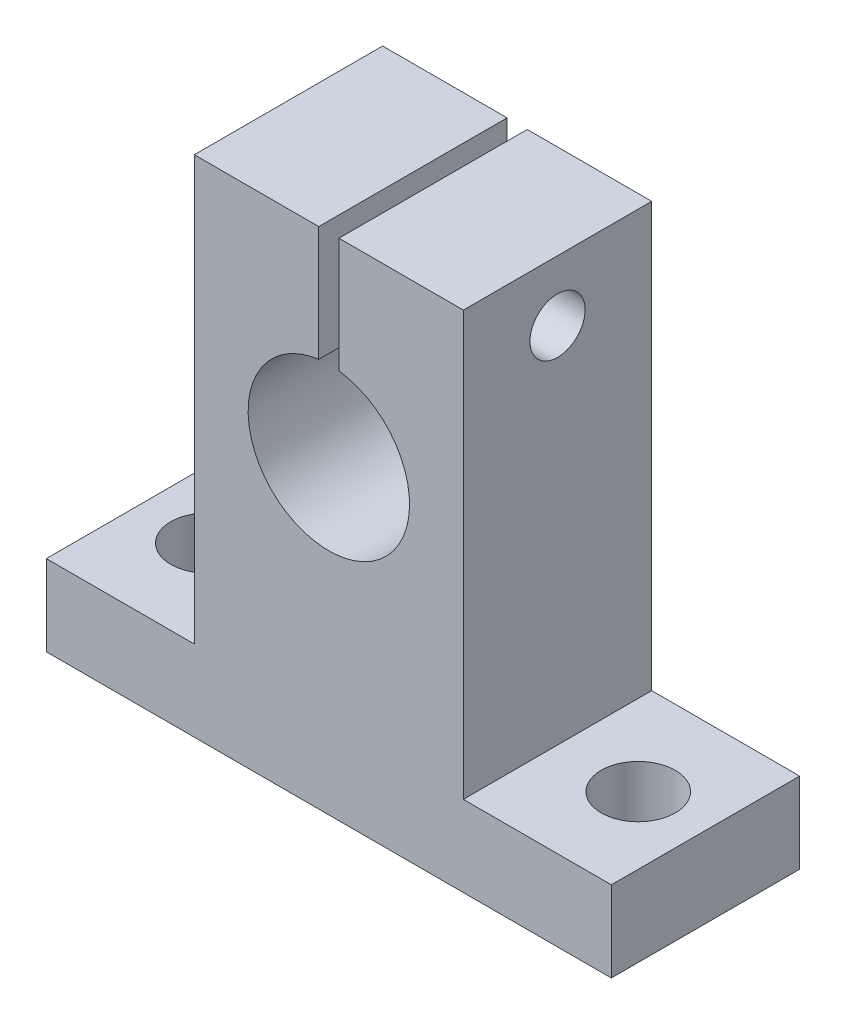
ISO-10303-21;
HEADER;
FILE_DESCRIPTION(('STEP AP214'),'2;1');
FILE_NAME('part.step','',(''),(''),'','','');
FILE_SCHEMA(('AUTOMOTIVE_DESIGN { 1 0 10303 214 1 1 1 1 }'));
ENDSEC;
DATA;
#1=APPLICATION_CONTEXT('core data for automotive mechanical design processes');
#2=APPLICATION_PROTOCOL_DEFINITION('international standard','automotive_design',2000,#1);
#3=PRODUCT_CONTEXT('',#1,'mechanical');
#4=PRODUCT('Part','Part','',(#3));
#5=PRODUCT_RELATED_PRODUCT_CATEGORY('part','',(#4));
#6=PRODUCT_DEFINITION_FORMATION('','',#4);
#7=PRODUCT_DEFINITION_CONTEXT('part definition',#1,'design');
#8=PRODUCT_DEFINITION('design','',#6,#7);
#9=PRODUCT_DEFINITION_SHAPE('','',#8);
#10=(LENGTH_UNIT() NAMED_UNIT(*) SI_UNIT(.MILLI.,.METRE.));
#11=(NAMED_UNIT(*) PLANE_ANGLE_UNIT() SI_UNIT($,.RADIAN.));
#12=(NAMED_UNIT(*) SI_UNIT($,.STERADIAN.) SOLID_ANGLE_UNIT());
#13=UNCERTAINTY_MEASURE_WITH_UNIT(LENGTH_MEASURE(1.E-05),#10,'distance_accuracy_value','');
#14=(GEOMETRIC_REPRESENTATION_CONTEXT(3) GLOBAL_UNCERTAINTY_ASSIGNED_CONTEXT((#13)) GLOBAL_UNIT_ASSIGNED_CONTEXT((#10,
#11,#12)) REPRESENTATION_CONTEXT('',''));
#15=CARTESIAN_POINT('',(0.,0.,0.));
#16=DIRECTION('',(0.,0.,1.));
#17=DIRECTION('',(1.,0.,0.));
#18=AXIS2_PLACEMENT_3D('',#15,#16,#17);
#19=CARTESIAN_POINT('',(10.,37.5,7.));
#20=DIRECTION('',(0.,-1.,0.));
#21=DIRECTION('',(0.,0.,-1.));
#22=AXIS2_PLACEMENT_3D('',#19,#20,#21);
#23=PLANE('',#22);
#24=DIRECTION('',(-1.,0.,0.));
#25=VECTOR('',#24,1.);
#26=CARTESIAN_POINT('',(10.,37.5,-7.));
#27=LINE('',#26,#25);
#28=CARTESIAN_POINT('',(10.,37.5,-7.));
#29=VERTEX_POINT('',#28);
#30=CARTESIAN_POINT('',(0.74999999999995,37.5,-7.));
#31=VERTEX_POINT('',#30);
#32=EDGE_CURVE('E163',#29,#31,#27,.T.);
#33=ORIENTED_EDGE('',*,*,#32,.T.);
#34=DIRECTION('',(0.,0.,1.));
#35=VECTOR('',#34,1.);
#36=CARTESIAN_POINT('',(0.74999999999995,37.5,7.));
#37=LINE('',#36,#35);
#38=CARTESIAN_POINT('',(0.74999999999995,37.5,7.));
#39=VERTEX_POINT('',#38);
#40=EDGE_CURVE('E191',#31,#39,#37,.T.);
#41=ORIENTED_EDGE('',*,*,#40,.T.);
#42=DIRECTION('',(-1.,0.,0.));
#43=VECTOR('',#42,1.);
#44=CARTESIAN_POINT('',(10.,37.5,7.));
#45=LINE('',#44,#43);
#46=CARTESIAN_POINT('',(10.,37.5,7.));
#47=VERTEX_POINT('',#46);
#48=EDGE_CURVE('E145',#47,#39,#45,.T.);
#49=ORIENTED_EDGE('',*,*,#48,.F.);
#50=DIRECTION('',(0.,0.,-1.));
#51=VECTOR('',#50,1.);
#52=CARTESIAN_POINT('',(10.,37.5,7.));
#53=LINE('',#52,#51);
#54=EDGE_CURVE('E149',#47,#29,#53,.T.);
#55=ORIENTED_EDGE('',*,*,#54,.T.);
#56=EDGE_LOOP('',(#33,#41,#49,#55));
#57=FACE_BOUND('',#56,.T.);
#58=ADVANCED_FACE('F32',(#57),#23,.F.);
#59=CARTESIAN_POINT('',(-21.,33.,0.));
#60=DIRECTION('',(1.,0.,0.));
#61=DIRECTION('',(0.,0.,-1.));
#62=AXIS2_PLACEMENT_3D('',#59,#60,#61);
#63=CYLINDRICAL_SURFACE('',#62,2.05);
#64=CARTESIAN_POINT('',(0.749999999999966,33.,0.));
#65=DIRECTION('',(1.,0.,0.));
#66=DIRECTION('',(0.,1.,0.));
#67=AXIS2_PLACEMENT_3D('',#64,#65,#66);
#68=CIRCLE('',#67,2.05);
#69=CARTESIAN_POINT('',(0.749999999999958,35.05,0.));
#70=VERTEX_POINT('',#69);
#71=EDGE_CURVE('E36',#70,#70,#68,.F.);
#72=ORIENTED_EDGE('',*,*,#71,.T.);
#73=EDGE_LOOP('',(#72));
#74=FACE_BOUND('',#73,.T.);
#75=CARTESIAN_POINT('',(10.,33.,0.));
#76=DIRECTION('',(1.,0.,0.));
#77=DIRECTION('',(0.,0.,-1.));
#78=AXIS2_PLACEMENT_3D('',#75,#76,#77);
#79=CIRCLE('',#78,2.05);
#80=CARTESIAN_POINT('',(10.,33.,-2.05));
#81=VERTEX_POINT('',#80);
#82=EDGE_CURVE('E176',#81,#81,#79,.T.);
#83=ORIENTED_EDGE('',*,*,#82,.T.);
#84=EDGE_LOOP('',(#83));
#85=FACE_BOUND('',#84,.T.);
#86=ADVANCED_FACE('F280',(#74,#85),#63,.F.);
#87=CARTESIAN_POINT('',(0.,0.,7.));
#88=DIRECTION('',(0.,1.,0.));
#89=DIRECTION('',(0.,0.,1.));
#90=AXIS2_PLACEMENT_3D('',#87,#88,#89);
#91=PLANE('',#90);
#92=CARTESIAN_POINT('',(16.,0.,0.));
#93=DIRECTION('',(0.,1.,0.));
#94=DIRECTION('',(0.,0.,1.));
#95=AXIS2_PLACEMENT_3D('',#92,#93,#94);
#96=CIRCLE('',#95,2.75);
#97=CARTESIAN_POINT('',(16.,0.,2.75));
#98=VERTEX_POINT('',#97);
#99=EDGE_CURVE('E197',#98,#98,#96,.T.);
#100=ORIENTED_EDGE('',*,*,#99,.T.);
#101=EDGE_LOOP('',(#100));
#102=FACE_BOUND('',#101,.T.);
#103=CARTESIAN_POINT('',(-16.,0.,0.));
#104=DIRECTION('',(0.,1.,0.));
#105=DIRECTION('',(0.,0.,1.));
#106=AXIS2_PLACEMENT_3D('',#103,#104,#105);
#107=CIRCLE('',#106,2.75);
#108=CARTESIAN_POINT('',(-16.,0.,2.75));
#109=VERTEX_POINT('',#108);
#110=EDGE_CURVE('E203',#109,#109,#107,.T.);
#111=ORIENTED_EDGE('',*,*,#110,.T.);
#112=EDGE_LOOP('',(#111));
#113=FACE_BOUND('',#112,.T.);
#114=DIRECTION('',(1.,0.,0.));
#115=VECTOR('',#114,1.);
#116=CARTESIAN_POINT('',(0.,0.,-7.));
#117=LINE('',#116,#115);
#118=CARTESIAN_POINT('',(-21.,0.,-7.));
#119=VERTEX_POINT('',#118);
#120=CARTESIAN_POINT('',(21.,0.,-7.));
#121=VERTEX_POINT('',#120);
#122=EDGE_CURVE('E154',#119,#121,#117,.T.);
#123=ORIENTED_EDGE('',*,*,#122,.T.);
#124=DIRECTION('',(0.,0.,-1.));
#125=VECTOR('',#124,1.);
#126=CARTESIAN_POINT('',(21.,0.,7.));
#127=LINE('',#126,#125);
#128=CARTESIAN_POINT('',(21.,0.,7.));
#129=VERTEX_POINT('',#128);
#130=EDGE_CURVE('E11',#129,#121,#127,.T.);
#131=ORIENTED_EDGE('',*,*,#130,.F.);
#132=DIRECTION('',(1.,0.,0.));
#133=VECTOR('',#132,1.);
#134=CARTESIAN_POINT('',(0.,0.,7.));
#135=LINE('',#134,#133);
#136=CARTESIAN_POINT('',(-21.,0.,7.));
#137=VERTEX_POINT('',#136);
#138=EDGE_CURVE('E166',#137,#129,#135,.T.);
#139=ORIENTED_EDGE('',*,*,#138,.F.);
#140=DIRECTION('',(0.,0.,-1.));
#141=VECTOR('',#140,1.);
#142=CARTESIAN_POINT('',(-21.,0.,7.));
#143=LINE('',#142,#141);
#144=EDGE_CURVE('E221',#137,#119,#143,.T.);
#145=ORIENTED_EDGE('',*,*,#144,.T.);
#146=EDGE_LOOP('',(#123,#131,#139,#145));
#147=FACE_BOUND('',#146,.T.);
#148=ADVANCED_FACE('F34',(#102,#113,#147),#91,.F.);
#149=CARTESIAN_POINT('',(21.,0.,7.));
#150=DIRECTION('',(-1.,0.,0.));
#151=DIRECTION('',(0.,0.,1.));
#152=AXIS2_PLACEMENT_3D('',#149,#150,#151);
#153=PLANE('',#152);
#154=DIRECTION('',(0.,1.,0.));
#155=VECTOR('',#154,1.);
#156=CARTESIAN_POINT('',(21.,0.,-7.));
#157=LINE('',#156,#155);
#158=CARTESIAN_POINT('',(21.,6.,-7.));
#159=VERTEX_POINT('',#158);
#160=EDGE_CURVE('E156',#121,#159,#157,.T.);
#161=ORIENTED_EDGE('',*,*,#160,.T.);
#162=DIRECTION('',(0.,0.,-1.));
#163=VECTOR('',#162,1.);
#164=CARTESIAN_POINT('',(21.,6.,7.));
#165=LINE('',#164,#163);
#166=CARTESIAN_POINT('',(21.,6.,7.));
#167=VERTEX_POINT('',#166);
#168=EDGE_CURVE('E41',#167,#159,#165,.T.);
#169=ORIENTED_EDGE('',*,*,#168,.F.);
#170=DIRECTION('',(0.,1.,0.));
#171=VECTOR('',#170,1.);
#172=CARTESIAN_POINT('',(21.,0.,7.));
#173=LINE('',#172,#171);
#174=EDGE_CURVE('E237',#129,#167,#173,.T.);
#175=ORIENTED_EDGE('',*,*,#174,.F.);
#176=ORIENTED_EDGE('',*,*,#130,.T.);
#177=EDGE_LOOP('',(#161,#169,#175,#176));
#178=FACE_BOUND('',#177,.T.);
#179=ADVANCED_FACE('F272',(#178),#153,.F.);
#180=CARTESIAN_POINT('',(21.,6.,7.));
#181=DIRECTION('',(0.,-1.,0.));
#182=DIRECTION('',(1.,0.,0.));
#183=AXIS2_PLACEMENT_3D('',#180,#181,#182);
#184=PLANE('',#183);
#185=CARTESIAN_POINT('',(16.,6.,0.));
#186=DIRECTION('',(0.,1.,0.));
#187=DIRECTION('',(-1.,0.,0.));
#188=AXIS2_PLACEMENT_3D('',#185,#186,#187);
#189=CIRCLE('',#188,2.75);
#190=CARTESIAN_POINT('',(13.25,6.,0.));
#191=VERTEX_POINT('',#190);
#192=EDGE_CURVE('E194',#191,#191,#189,.T.);
#193=ORIENTED_EDGE('',*,*,#192,.F.);
#194=EDGE_LOOP('',(#193));
#195=FACE_BOUND('',#194,.T.);
#196=DIRECTION('',(-1.,0.,0.));
#197=VECTOR('',#196,1.);
#198=CARTESIAN_POINT('',(21.,6.,-7.));
#199=LINE('',#198,#197);
#200=CARTESIAN_POINT('',(10.,6.,-7.));
#201=VERTEX_POINT('',#200);
#202=EDGE_CURVE('E158',#159,#201,#199,.T.);
#203=ORIENTED_EDGE('',*,*,#202,.T.);
#204=DIRECTION('',(0.,0.,-1.));
#205=VECTOR('',#204,1.);
#206=CARTESIAN_POINT('',(10.,6.,7.));
#207=LINE('',#206,#205);
#208=CARTESIAN_POINT('',(10.,6.,7.));
#209=VERTEX_POINT('',#208);
#210=EDGE_CURVE('E169',#209,#201,#207,.T.);
#211=ORIENTED_EDGE('',*,*,#210,.F.);
#212=DIRECTION('',(-1.,0.,0.));
#213=VECTOR('',#212,1.);
#214=CARTESIAN_POINT('',(21.,6.,7.));
#215=LINE('',#214,#213);
#216=EDGE_CURVE('E150',#167,#209,#215,.T.);
#217=ORIENTED_EDGE('',*,*,#216,.F.);
#218=ORIENTED_EDGE('',*,*,#168,.T.);
#219=EDGE_LOOP('',(#203,#211,#217,#218));
#220=FACE_BOUND('',#219,.T.);
#221=ADVANCED_FACE('F245',(#195,#220),#184,.F.);
#222=CARTESIAN_POINT('',(10.,6.,7.));
#223=DIRECTION('',(-1.,0.,0.));
#224=DIRECTION('',(0.,0.,1.));
#225=AXIS2_PLACEMENT_3D('',#222,#223,#224);
#226=PLANE('',#225);
#227=ORIENTED_EDGE('',*,*,#82,.F.);
#228=EDGE_LOOP('',(#227));
#229=FACE_BOUND('',#228,.T.);
#230=DIRECTION('',(0.,1.,0.));
#231=VECTOR('',#230,1.);
#232=CARTESIAN_POINT('',(10.,6.,-7.));
#233=LINE('',#232,#231);
#234=EDGE_CURVE('E160',#201,#29,#233,.T.);
#235=ORIENTED_EDGE('',*,*,#234,.T.);
#236=ORIENTED_EDGE('',*,*,#54,.F.);
#237=DIRECTION('',(0.,1.,0.));
#238=VECTOR('',#237,1.);
#239=CARTESIAN_POINT('',(10.,6.,7.));
#240=LINE('',#239,#238);
#241=EDGE_CURVE('E146',#209,#47,#240,.T.);
#242=ORIENTED_EDGE('',*,*,#241,.F.);
#243=ORIENTED_EDGE('',*,*,#210,.T.);
#244=EDGE_LOOP('',(#235,#236,#242,#243));
#245=FACE_BOUND('',#244,.T.);
#246=ADVANCED_FACE('F249',(#229,#245),#226,.F.);
#247=CARTESIAN_POINT('',(-0.75000000000005,37.5,7.));
#248=VERTEX_POINT('',#247);
#249=CARTESIAN_POINT('',(-10.,37.5,7.));
#250=VERTEX_POINT('',#249);
#251=EDGE_CURVE('E135',#248,#250,#45,.T.);
#252=ORIENTED_EDGE('',*,*,#251,.F.);
#253=DIRECTION('',(0.,0.,-1.));
#254=VECTOR('',#253,1.);
#255=CARTESIAN_POINT('',(-0.750000000000048,37.5,7.));
#256=LINE('',#255,#254);
#257=CARTESIAN_POINT('',(-0.75000000000005,37.5,-7.));
#258=VERTEX_POINT('',#257);
#259=EDGE_CURVE('E121',#248,#258,#256,.T.);
#260=ORIENTED_EDGE('',*,*,#259,.T.);
#261=CARTESIAN_POINT('',(-10.,37.5,-7.));
#262=VERTEX_POINT('',#261);
#263=EDGE_CURVE('E162',#258,#262,#27,.T.);
#264=ORIENTED_EDGE('',*,*,#263,.T.);
#265=DIRECTION('',(0.,0.,-1.));
#266=VECTOR('',#265,1.);
#267=CARTESIAN_POINT('',(-10.,37.5,7.));
#268=LINE('',#267,#266);
#269=EDGE_CURVE('E143',#250,#262,#268,.T.);
#270=ORIENTED_EDGE('',*,*,#269,.F.);
#271=EDGE_LOOP('',(#252,#260,#264,#270));
#272=FACE_BOUND('',#271,.T.);
#273=ADVANCED_FACE('F141',(#272),#23,.F.);
#274=CARTESIAN_POINT('',(0.,0.,7.));
#275=DIRECTION('',(0.,0.,1.));
#276=DIRECTION('',(1.,0.,0.));
#277=AXIS2_PLACEMENT_3D('',#274,#275,#276);
#278=PLANE('',#277);
#279=DIRECTION('',(0.,1.,0.));
#280=VECTOR('',#279,1.);
#281=CARTESIAN_POINT('',(0.749999999999897,52.,7.));
#282=LINE('',#281,#280);
#283=CARTESIAN_POINT('',(0.749999999999981,28.9529404498953,7.));
#284=VERTEX_POINT('',#283);
#285=EDGE_CURVE('E139',#284,#39,#282,.T.);
#286=ORIENTED_EDGE('',*,*,#285,.F.);
#287=CARTESIAN_POINT('',(0.,23.,7.));
#288=DIRECTION('',(0.,0.,1.));
#289=DIRECTION('',(1.,0.,0.));
#290=AXIS2_PLACEMENT_3D('',#287,#288,#289);
#291=CIRCLE('',#290,6.);
#292=CARTESIAN_POINT('',(-0.750000000000019,28.9529404498953,7.));
#293=VERTEX_POINT('',#292);
#294=EDGE_CURVE('E138',#293,#284,#291,.T.);
#295=ORIENTED_EDGE('',*,*,#294,.F.);
#296=DIRECTION('',(0.,-1.,0.));
#297=VECTOR('',#296,1.);
#298=CARTESIAN_POINT('',(-0.750000000000103,52.,7.));
#299=LINE('',#298,#297);
#300=EDGE_CURVE('E49',#248,#293,#299,.T.);
#301=ORIENTED_EDGE('',*,*,#300,.F.);
#302=ORIENTED_EDGE('',*,*,#251,.T.);
#303=DIRECTION('',(0.,1.,0.));
#304=VECTOR('',#303,1.);
#305=CARTESIAN_POINT('',(-10.,6.,7.));
#306=LINE('',#305,#304);
#307=CARTESIAN_POINT('',(-10.,6.,7.));
#308=VERTEX_POINT('',#307);
#309=EDGE_CURVE('E212',#308,#250,#306,.T.);
#310=ORIENTED_EDGE('',*,*,#309,.F.);
#311=DIRECTION('',(1.,0.,0.));
#312=VECTOR('',#311,1.);
#313=CARTESIAN_POINT('',(-21.,6.,7.));
#314=LINE('',#313,#312);
#315=CARTESIAN_POINT('',(-21.,6.,7.));
#316=VERTEX_POINT('',#315);
#317=EDGE_CURVE('E214',#316,#308,#314,.T.);
#318=ORIENTED_EDGE('',*,*,#317,.F.);
#319=DIRECTION('',(0.,1.,0.));
#320=VECTOR('',#319,1.);
#321=CARTESIAN_POINT('',(-21.,0.,7.));
#322=LINE('',#321,#320);
#323=EDGE_CURVE('E218',#137,#316,#322,.T.);
#324=ORIENTED_EDGE('',*,*,#323,.F.);
#325=ORIENTED_EDGE('',*,*,#138,.T.);
#326=ORIENTED_EDGE('',*,*,#174,.T.);
#327=ORIENTED_EDGE('',*,*,#216,.T.);
#328=ORIENTED_EDGE('',*,*,#241,.T.);
#329=ORIENTED_EDGE('',*,*,#48,.T.);
#330=EDGE_LOOP('',(#286,#295,#301,#302,#310,#318,#324,#325,#326,#327,#328,#329));
#331=FACE_BOUND('',#330,.T.);
#332=ADVANCED_FACE('F133',(#331),#278,.T.);
#333=CARTESIAN_POINT('',(0.,0.,-7.));
#334=DIRECTION('',(0.,0.,1.));
#335=DIRECTION('',(1.,0.,0.));
#336=AXIS2_PLACEMENT_3D('',#333,#334,#335);
#337=PLANE('',#336);
#338=CARTESIAN_POINT('',(0.,23.,-7.));
#339=DIRECTION('',(0.,0.,1.));
#340=DIRECTION('',(1.,0.,0.));
#341=AXIS2_PLACEMENT_3D('',#338,#339,#340);
#342=CIRCLE('',#341,6.);
#343=CARTESIAN_POINT('',(-0.750000000000018,28.9529404498953,-7.));
#344=VERTEX_POINT('',#343);
#345=CARTESIAN_POINT('',(0.749999999999981,28.9529404498953,-7.));
#346=VERTEX_POINT('',#345);
#347=EDGE_CURVE('E208',#344,#346,#342,.T.);
#348=ORIENTED_EDGE('',*,*,#347,.T.);
#349=DIRECTION('',(0.,1.,0.));
#350=VECTOR('',#349,1.);
#351=CARTESIAN_POINT('',(0.749999999999897,52.,-7.));
#352=LINE('',#351,#350);
#353=EDGE_CURVE('E57',#346,#31,#352,.T.);
#354=ORIENTED_EDGE('',*,*,#353,.T.);
#355=ORIENTED_EDGE('',*,*,#32,.F.);
#356=ORIENTED_EDGE('',*,*,#234,.F.);
#357=ORIENTED_EDGE('',*,*,#202,.F.);
#358=ORIENTED_EDGE('',*,*,#160,.F.);
#359=ORIENTED_EDGE('',*,*,#122,.F.);
#360=DIRECTION('',(0.,1.,0.));
#361=VECTOR('',#360,1.);
#362=CARTESIAN_POINT('',(-21.,0.,-7.));
#363=LINE('',#362,#361);
#364=CARTESIAN_POINT('',(-21.,6.,-7.));
#365=VERTEX_POINT('',#364);
#366=EDGE_CURVE('E215',#119,#365,#363,.T.);
#367=ORIENTED_EDGE('',*,*,#366,.T.);
#368=DIRECTION('',(1.,0.,0.));
#369=VECTOR('',#368,1.);
#370=CARTESIAN_POINT('',(-21.,6.,-7.));
#371=LINE('',#370,#369);
#372=CARTESIAN_POINT('',(-10.,6.,-7.));
#373=VERTEX_POINT('',#372);
#374=EDGE_CURVE('E224',#365,#373,#371,.T.);
#375=ORIENTED_EDGE('',*,*,#374,.T.);
#376=DIRECTION('',(0.,1.,0.));
#377=VECTOR('',#376,1.);
#378=CARTESIAN_POINT('',(-10.,6.,-7.));
#379=LINE('',#378,#377);
#380=EDGE_CURVE('E210',#373,#262,#379,.T.);
#381=ORIENTED_EDGE('',*,*,#380,.T.);
#382=ORIENTED_EDGE('',*,*,#263,.F.);
#383=DIRECTION('',(0.,-1.,0.));
#384=VECTOR('',#383,1.);
#385=CARTESIAN_POINT('',(-0.750000000000103,52.,-7.));
#386=LINE('',#385,#384);
#387=EDGE_CURVE('E124',#258,#344,#386,.T.);
#388=ORIENTED_EDGE('',*,*,#387,.T.);
#389=EDGE_LOOP('',(#348,#354,#355,#356,#357,#358,#359,#367,#375,#381,#382,#388));
#390=FACE_BOUND('',#389,.T.);
#391=ADVANCED_FACE('F255',(#390),#337,.F.);
#392=CARTESIAN_POINT('',(-10.,6.,7.));
#393=DIRECTION('',(-1.,0.,0.));
#394=DIRECTION('',(0.,0.,1.));
#395=AXIS2_PLACEMENT_3D('',#392,#393,#394);
#396=PLANE('',#395);
#397=CARTESIAN_POINT('',(-10.,33.,0.));
#398=DIRECTION('',(-1.,0.,0.));
#399=DIRECTION('',(0.,0.,1.));
#400=AXIS2_PLACEMENT_3D('',#397,#398,#399);
#401=CIRCLE('',#400,2.05);
#402=CARTESIAN_POINT('',(-10.,33.,2.05));
#403=VERTEX_POINT('',#402);
#404=EDGE_CURVE('E174',#403,#403,#401,.T.);
#405=ORIENTED_EDGE('',*,*,#404,.F.);
#406=EDGE_LOOP('',(#405));
#407=FACE_BOUND('',#406,.T.);
#408=ORIENTED_EDGE('',*,*,#380,.F.);
#409=DIRECTION('',(0.,0.,-1.));
#410=VECTOR('',#409,1.);
#411=CARTESIAN_POINT('',(-10.,6.,7.));
#412=LINE('',#411,#410);
#413=EDGE_CURVE('E233',#308,#373,#412,.T.);
#414=ORIENTED_EDGE('',*,*,#413,.F.);
#415=ORIENTED_EDGE('',*,*,#309,.T.);
#416=ORIENTED_EDGE('',*,*,#269,.T.);
#417=EDGE_LOOP('',(#408,#414,#415,#416));
#418=FACE_BOUND('',#417,.T.);
#419=ADVANCED_FACE('F258',(#407,#418),#396,.T.);
#420=CARTESIAN_POINT('',(-21.,6.,7.));
#421=DIRECTION('',(0.,1.,0.));
#422=DIRECTION('',(-1.,0.,0.));
#423=AXIS2_PLACEMENT_3D('',#420,#421,#422);
#424=PLANE('',#423);
#425=CARTESIAN_POINT('',(-16.,5.99999999999999,0.));
#426=DIRECTION('',(0.,1.,0.));
#427=DIRECTION('',(-1.,0.,0.));
#428=AXIS2_PLACEMENT_3D('',#425,#426,#427);
#429=CIRCLE('',#428,2.75);
#430=CARTESIAN_POINT('',(-18.75,5.99999999999999,0.));
#431=VERTEX_POINT('',#430);
#432=EDGE_CURVE('E200',#431,#431,#429,.T.);
#433=ORIENTED_EDGE('',*,*,#432,.F.);
#434=EDGE_LOOP('',(#433));
#435=FACE_BOUND('',#434,.T.);
#436=ORIENTED_EDGE('',*,*,#374,.F.);
#437=DIRECTION('',(0.,0.,-1.));
#438=VECTOR('',#437,1.);
#439=CARTESIAN_POINT('',(-21.,6.,7.));
#440=LINE('',#439,#438);
#441=EDGE_CURVE('E231',#316,#365,#440,.T.);
#442=ORIENTED_EDGE('',*,*,#441,.F.);
#443=ORIENTED_EDGE('',*,*,#317,.T.);
#444=ORIENTED_EDGE('',*,*,#413,.T.);
#445=EDGE_LOOP('',(#436,#442,#443,#444));
#446=FACE_BOUND('',#445,.T.);
#447=ADVANCED_FACE('F263',(#435,#446),#424,.T.);
#448=CARTESIAN_POINT('',(-21.,0.,7.));
#449=DIRECTION('',(-1.,0.,0.));
#450=DIRECTION('',(0.,0.,1.));
#451=AXIS2_PLACEMENT_3D('',#448,#449,#450);
#452=PLANE('',#451);
#453=ORIENTED_EDGE('',*,*,#366,.F.);
#454=ORIENTED_EDGE('',*,*,#144,.F.);
#455=ORIENTED_EDGE('',*,*,#323,.T.);
#456=ORIENTED_EDGE('',*,*,#441,.T.);
#457=EDGE_LOOP('',(#453,#454,#455,#456));
#458=FACE_BOUND('',#457,.T.);
#459=ADVANCED_FACE('F266',(#458),#452,.T.);
#460=CARTESIAN_POINT('',(0.,23.,-7.));
#461=DIRECTION('',(0.,0.,1.));
#462=DIRECTION('',(1.,0.,0.));
#463=AXIS2_PLACEMENT_3D('',#460,#461,#462);
#464=CYLINDRICAL_SURFACE('',#463,6.);
#465=ORIENTED_EDGE('',*,*,#294,.T.);
#466=DIRECTION('',(0.,0.,1.));
#467=VECTOR('',#466,1.);
#468=CARTESIAN_POINT('',(0.749999999999981,28.9529404498953,-7.));
#469=LINE('',#468,#467);
#470=EDGE_CURVE('E189',#284,#346,#469,.F.);
#471=ORIENTED_EDGE('',*,*,#470,.T.);
#472=ORIENTED_EDGE('',*,*,#347,.F.);
#473=DIRECTION('',(0.,0.,1.));
#474=VECTOR('',#473,1.);
#475=CARTESIAN_POINT('',(-0.750000000000018,28.9529404498953,-7.));
#476=LINE('',#475,#474);
#477=EDGE_CURVE('E128',#344,#293,#476,.T.);
#478=ORIENTED_EDGE('',*,*,#477,.T.);
#479=EDGE_LOOP('',(#465,#471,#472,#478));
#480=FACE_BOUND('',#479,.T.);
#481=ADVANCED_FACE('F253',(#480),#464,.F.);
#482=CARTESIAN_POINT('',(-0.750000000000035,33.,0.));
#483=DIRECTION('',(-1.,0.,0.));
#484=DIRECTION('',(0.,-1.,0.));
#485=AXIS2_PLACEMENT_3D('',#482,#483,#484);
#486=CIRCLE('',#485,2.05);
#487=CARTESIAN_POINT('',(-0.750000000000028,30.95,0.));
#488=VERTEX_POINT('',#487);
#489=EDGE_CURVE('E177',#488,#488,#486,.F.);
#490=ORIENTED_EDGE('',*,*,#489,.T.);
#491=EDGE_LOOP('',(#490));
#492=FACE_BOUND('',#491,.T.);
#493=ORIENTED_EDGE('',*,*,#404,.T.);
#494=EDGE_LOOP('',(#493));
#495=FACE_BOUND('',#494,.T.);
#496=ADVANCED_FACE('F289',(#492,#495),#63,.F.);
#497=CARTESIAN_POINT('',(-16.,-8.00000000000001,0.));
#498=DIRECTION('',(0.,1.,0.));
#499=DIRECTION('',(-1.,0.,0.));
#500=AXIS2_PLACEMENT_3D('',#497,#498,#499);
#501=CYLINDRICAL_SURFACE('',#500,2.75);
#502=ORIENTED_EDGE('',*,*,#432,.T.);
#503=EDGE_LOOP('',(#502));
#504=FACE_BOUND('',#503,.T.);
#505=ORIENTED_EDGE('',*,*,#110,.F.);
#506=EDGE_LOOP('',(#505));
#507=FACE_BOUND('',#506,.T.);
#508=ADVANCED_FACE('F331',(#504,#507),#501,.F.);
#509=CARTESIAN_POINT('',(16.,-8.,0.));
#510=DIRECTION('',(0.,1.,0.));
#511=DIRECTION('',(-1.,0.,0.));
#512=AXIS2_PLACEMENT_3D('',#509,#510,#511);
#513=CYLINDRICAL_SURFACE('',#512,2.75);
#514=ORIENTED_EDGE('',*,*,#192,.T.);
#515=EDGE_LOOP('',(#514));
#516=FACE_BOUND('',#515,.T.);
#517=ORIENTED_EDGE('',*,*,#99,.F.);
#518=EDGE_LOOP('',(#517));
#519=FACE_BOUND('',#518,.T.);
#520=ADVANCED_FACE('F336',(#516,#519),#513,.F.);
#521=CARTESIAN_POINT('',(-0.750000000000103,52.,-7.));
#522=DIRECTION('',(-1.,0.,0.));
#523=DIRECTION('',(0.,-1.,0.));
#524=AXIS2_PLACEMENT_3D('',#521,#522,#523);
#525=PLANE('',#524);
#526=ORIENTED_EDGE('',*,*,#489,.F.);
#527=EDGE_LOOP('',(#526));
#528=FACE_BOUND('',#527,.T.);
#529=ORIENTED_EDGE('',*,*,#300,.T.);
#530=ORIENTED_EDGE('',*,*,#477,.F.);
#531=ORIENTED_EDGE('',*,*,#387,.F.);
#532=ORIENTED_EDGE('',*,*,#259,.F.);
#533=EDGE_LOOP('',(#529,#530,#531,#532));
#534=FACE_BOUND('',#533,.T.);
#535=ADVANCED_FACE('F122',(#528,#534),#525,.F.);
#536=CARTESIAN_POINT('',(0.749999999999897,52.,-7.));
#537=DIRECTION('',(1.,0.,0.));
#538=DIRECTION('',(0.,1.,0.));
#539=AXIS2_PLACEMENT_3D('',#536,#537,#538);
#540=PLANE('',#539);
#541=ORIENTED_EDGE('',*,*,#71,.F.);
#542=EDGE_LOOP('',(#541));
#543=FACE_BOUND('',#542,.T.);
#544=ORIENTED_EDGE('',*,*,#353,.F.);
#545=ORIENTED_EDGE('',*,*,#470,.F.);
#546=ORIENTED_EDGE('',*,*,#285,.T.);
#547=ORIENTED_EDGE('',*,*,#40,.F.);
#548=EDGE_LOOP('',(#544,#545,#546,#547));
#549=FACE_BOUND('',#548,.T.);
#550=ADVANCED_FACE('F401',(#543,#549),#540,.F.);
#551=CLOSED_SHELL('',(#58,#86,#148,#179,#221,#246,#273,#332,#391,#419,#447,#459,#481,#496,#508,
#520,#535,#550));
#552=MANIFOLD_SOLID_BREP('B2',#551);
#553=ADVANCED_BREP_SHAPE_REPRESENTATION('',(#18,#552),#14);
#554=SHAPE_DEFINITION_REPRESENTATION(#9,#553);
ENDSEC;
END-ISO-10303-21;
